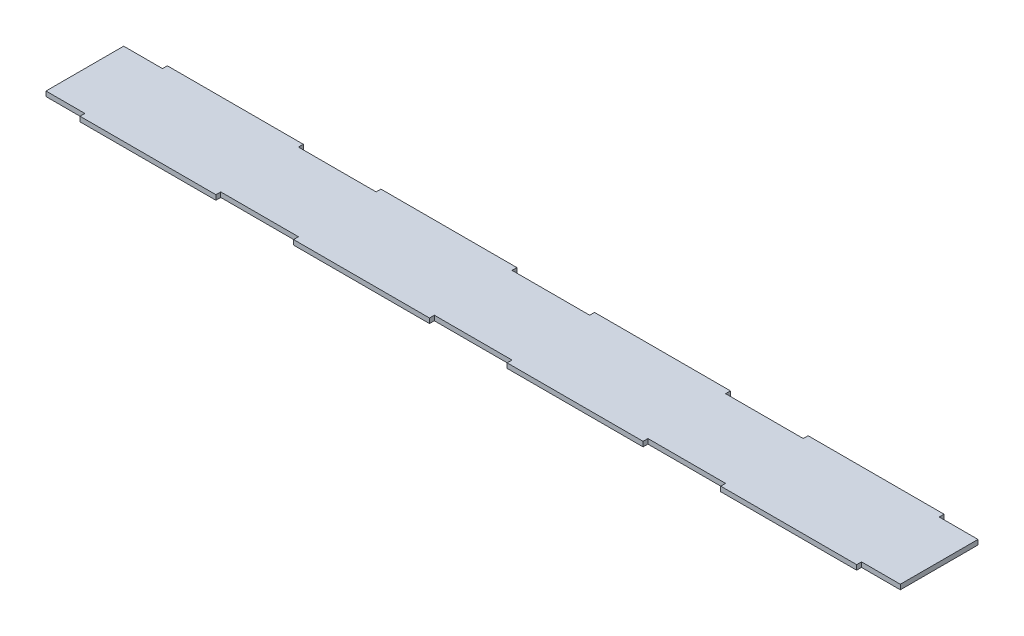
ISO-10303-21;
HEADER;
FILE_DESCRIPTION(('STEP AP214'),'2;1');
FILE_NAME('part.step','',(''),(''),'','','');
FILE_SCHEMA(('AUTOMOTIVE_DESIGN { 1 0 10303 214 1 1 1 1 }'));
ENDSEC;
DATA;
#1=APPLICATION_CONTEXT('core data for automotive mechanical design processes');
#2=APPLICATION_PROTOCOL_DEFINITION('international standard','automotive_design',2000,#1);
#3=PRODUCT_CONTEXT('',#1,'mechanical');
#4=PRODUCT('Part','Part','',(#3));
#5=PRODUCT_RELATED_PRODUCT_CATEGORY('part','',(#4));
#6=PRODUCT_DEFINITION_FORMATION('','',#4);
#7=PRODUCT_DEFINITION_CONTEXT('part definition',#1,'design');
#8=PRODUCT_DEFINITION('design','',#6,#7);
#9=PRODUCT_DEFINITION_SHAPE('','',#8);
#10=(LENGTH_UNIT() NAMED_UNIT(*) SI_UNIT(.MILLI.,.METRE.));
#11=(NAMED_UNIT(*) PLANE_ANGLE_UNIT() SI_UNIT($,.RADIAN.));
#12=(NAMED_UNIT(*) SI_UNIT($,.STERADIAN.) SOLID_ANGLE_UNIT());
#13=UNCERTAINTY_MEASURE_WITH_UNIT(LENGTH_MEASURE(1.E-05),#10,'distance_accuracy_value','');
#14=(GEOMETRIC_REPRESENTATION_CONTEXT(3) GLOBAL_UNCERTAINTY_ASSIGNED_CONTEXT((#13)) GLOBAL_UNIT_ASSIGNED_CONTEXT((#10,
#11,#12)) REPRESENTATION_CONTEXT('',''));
#15=CARTESIAN_POINT('',(0.,0.,0.));
#16=DIRECTION('',(0.,0.,1.));
#17=DIRECTION('',(1.,0.,0.));
#18=AXIS2_PLACEMENT_3D('',#15,#16,#17);
#19=CARTESIAN_POINT('',(0.,3.175,-25.4000000000001));
#20=DIRECTION('',(0.,0.,1.));
#21=DIRECTION('',(1.,0.,0.));
#22=AXIS2_PLACEMENT_3D('',#19,#20,#21);
#23=PLANE('',#22);
#24=DIRECTION('',(-1.,0.,0.));
#25=VECTOR('',#24,1.);
#26=CARTESIAN_POINT('',(0.,0.,-25.4000000000001));
#27=LINE('',#26,#25);
#28=CARTESIAN_POINT('',(25.4,0.,-25.4));
#29=VERTEX_POINT('',#28);
#30=CARTESIAN_POINT('',(0.,0.,-25.4000000000001));
#31=VERTEX_POINT('',#30);
#32=EDGE_CURVE('E308',#29,#31,#27,.T.);
#33=ORIENTED_EDGE('',*,*,#32,.T.);
#34=DIRECTION('',(0.,-1.,0.));
#35=VECTOR('',#34,1.);
#36=CARTESIAN_POINT('',(0.,3.175,-25.4000000000001));
#37=LINE('',#36,#35);
#38=CARTESIAN_POINT('',(0.,3.175,-25.4000000000001));
#39=VERTEX_POINT('',#38);
#40=EDGE_CURVE('E11',#39,#31,#37,.T.);
#41=ORIENTED_EDGE('',*,*,#40,.F.);
#42=DIRECTION('',(-1.,0.,0.));
#43=VECTOR('',#42,1.);
#44=CARTESIAN_POINT('',(0.,3.175,-25.4000000000001));
#45=LINE('',#44,#43);
#46=CARTESIAN_POINT('',(25.4,3.175,-25.4));
#47=VERTEX_POINT('',#46);
#48=EDGE_CURVE('E420',#47,#39,#45,.T.);
#49=ORIENTED_EDGE('',*,*,#48,.F.);
#50=DIRECTION('',(0.,-1.,0.));
#51=VECTOR('',#50,1.);
#52=CARTESIAN_POINT('',(25.4,3.175,-25.4));
#53=LINE('',#52,#51);
#54=EDGE_CURVE('E304',#47,#29,#53,.T.);
#55=ORIENTED_EDGE('',*,*,#54,.T.);
#56=EDGE_LOOP('',(#33,#41,#49,#55));
#57=FACE_BOUND('',#56,.T.);
#58=ADVANCED_FACE('F39',(#57),#23,.F.);
#59=CARTESIAN_POINT('',(0.,3.175,25.4000000000001));
#60=DIRECTION('',(1.,0.,0.));
#61=DIRECTION('',(0.,0.,-1.));
#62=AXIS2_PLACEMENT_3D('',#59,#60,#61);
#63=PLANE('',#62);
#64=DIRECTION('',(0.,0.,1.));
#65=VECTOR('',#64,1.);
#66=CARTESIAN_POINT('',(0.,0.,25.4000000000001));
#67=LINE('',#66,#65);
#68=CARTESIAN_POINT('',(0.,0.,25.4000000000001));
#69=VERTEX_POINT('',#68);
#70=EDGE_CURVE('E312',#31,#69,#67,.T.);
#71=ORIENTED_EDGE('',*,*,#70,.T.);
#72=DIRECTION('',(0.,-1.,0.));
#73=VECTOR('',#72,1.);
#74=CARTESIAN_POINT('',(0.,3.175,25.4000000000001));
#75=LINE('',#74,#73);
#76=CARTESIAN_POINT('',(0.,3.175,25.4000000000001));
#77=VERTEX_POINT('',#76);
#78=EDGE_CURVE('E48',#77,#69,#75,.T.);
#79=ORIENTED_EDGE('',*,*,#78,.F.);
#80=DIRECTION('',(0.,0.,1.));
#81=VECTOR('',#80,1.);
#82=CARTESIAN_POINT('',(0.,3.175,25.4000000000001));
#83=LINE('',#82,#81);
#84=EDGE_CURVE('E183',#39,#77,#83,.T.);
#85=ORIENTED_EDGE('',*,*,#84,.F.);
#86=ORIENTED_EDGE('',*,*,#40,.T.);
#87=EDGE_LOOP('',(#71,#79,#85,#86));
#88=FACE_BOUND('',#87,.T.);
#89=ADVANCED_FACE('F681',(#88),#63,.F.);
#90=CARTESIAN_POINT('',(0.,3.175,25.4000000000001));
#91=DIRECTION('',(0.,0.,-1.));
#92=DIRECTION('',(-1.,0.,0.));
#93=AXIS2_PLACEMENT_3D('',#90,#91,#92);
#94=PLANE('',#93);
#95=DIRECTION('',(1.,0.,0.));
#96=VECTOR('',#95,1.);
#97=CARTESIAN_POINT('',(0.,0.,25.4000000000001));
#98=LINE('',#97,#96);
#99=CARTESIAN_POINT('',(25.4,0.,25.4));
#100=VERTEX_POINT('',#99);
#101=EDGE_CURVE('E315',#69,#100,#98,.T.);
#102=ORIENTED_EDGE('',*,*,#101,.T.);
#103=DIRECTION('',(0.,-1.,0.));
#104=VECTOR('',#103,1.);
#105=CARTESIAN_POINT('',(25.4,3.175,25.4));
#106=LINE('',#105,#104);
#107=CARTESIAN_POINT('',(25.4,3.175,25.4));
#108=VERTEX_POINT('',#107);
#109=EDGE_CURVE('E543',#108,#100,#106,.T.);
#110=ORIENTED_EDGE('',*,*,#109,.F.);
#111=DIRECTION('',(1.,0.,0.));
#112=VECTOR('',#111,1.);
#113=CARTESIAN_POINT('',(0.,3.175,25.4000000000001));
#114=LINE('',#113,#112);
#115=EDGE_CURVE('E553',#77,#108,#114,.T.);
#116=ORIENTED_EDGE('',*,*,#115,.F.);
#117=ORIENTED_EDGE('',*,*,#78,.T.);
#118=EDGE_LOOP('',(#102,#110,#116,#117));
#119=FACE_BOUND('',#118,.T.);
#120=ADVANCED_FACE('F551',(#119),#94,.F.);
#121=CARTESIAN_POINT('',(25.4,3.175,25.4));
#122=DIRECTION('',(1.,0.,0.));
#123=DIRECTION('',(0.,0.,-1.));
#124=AXIS2_PLACEMENT_3D('',#121,#122,#123);
#125=PLANE('',#124);
#126=DIRECTION('',(0.,0.,1.));
#127=VECTOR('',#126,1.);
#128=CARTESIAN_POINT('',(25.4,0.,25.4));
#129=LINE('',#128,#127);
#130=CARTESIAN_POINT('',(25.4,0.,28.575));
#131=VERTEX_POINT('',#130);
#132=EDGE_CURVE('E318',#100,#131,#129,.T.);
#133=ORIENTED_EDGE('',*,*,#132,.T.);
#134=DIRECTION('',(0.,-1.,0.));
#135=VECTOR('',#134,1.);
#136=CARTESIAN_POINT('',(25.4,3.175,28.575));
#137=LINE('',#136,#135);
#138=CARTESIAN_POINT('',(25.4,3.175,28.575));
#139=VERTEX_POINT('',#138);
#140=EDGE_CURVE('E539',#139,#131,#137,.T.);
#141=ORIENTED_EDGE('',*,*,#140,.F.);
#142=DIRECTION('',(0.,0.,1.));
#143=VECTOR('',#142,1.);
#144=CARTESIAN_POINT('',(25.4,3.175,25.4));
#145=LINE('',#144,#143);
#146=EDGE_CURVE('E572',#108,#139,#145,.T.);
#147=ORIENTED_EDGE('',*,*,#146,.F.);
#148=ORIENTED_EDGE('',*,*,#109,.T.);
#149=EDGE_LOOP('',(#133,#141,#147,#148));
#150=FACE_BOUND('',#149,.T.);
#151=ADVANCED_FACE('F562',(#150),#125,.F.);
#152=CARTESIAN_POINT('',(25.4,3.175,28.575));
#153=DIRECTION('',(0.,0.,-1.));
#154=DIRECTION('',(-1.,0.,0.));
#155=AXIS2_PLACEMENT_3D('',#152,#153,#154);
#156=PLANE('',#155);
#157=DIRECTION('',(1.,0.,0.));
#158=VECTOR('',#157,1.);
#159=CARTESIAN_POINT('',(25.4,0.,28.575));
#160=LINE('',#159,#158);
#161=CARTESIAN_POINT('',(114.3,0.,28.575));
#162=VERTEX_POINT('',#161);
#163=EDGE_CURVE('E321',#131,#162,#160,.T.);
#164=ORIENTED_EDGE('',*,*,#163,.T.);
#165=DIRECTION('',(0.,-1.,0.));
#166=VECTOR('',#165,1.);
#167=CARTESIAN_POINT('',(114.3,3.175,28.575));
#168=LINE('',#167,#166);
#169=CARTESIAN_POINT('',(114.3,3.175,28.575));
#170=VERTEX_POINT('',#169);
#171=EDGE_CURVE('E535',#170,#162,#168,.T.);
#172=ORIENTED_EDGE('',*,*,#171,.F.);
#173=DIRECTION('',(1.,0.,0.));
#174=VECTOR('',#173,1.);
#175=CARTESIAN_POINT('',(25.4,3.175,28.575));
#176=LINE('',#175,#174);
#177=EDGE_CURVE('E568',#139,#170,#176,.T.);
#178=ORIENTED_EDGE('',*,*,#177,.F.);
#179=ORIENTED_EDGE('',*,*,#140,.T.);
#180=EDGE_LOOP('',(#164,#172,#178,#179));
#181=FACE_BOUND('',#180,.T.);
#182=ADVANCED_FACE('F566',(#181),#156,.F.);
#183=CARTESIAN_POINT('',(114.3,3.175,28.575));
#184=DIRECTION('',(-1.,0.,0.));
#185=DIRECTION('',(0.,0.,1.));
#186=AXIS2_PLACEMENT_3D('',#183,#184,#185);
#187=PLANE('',#186);
#188=DIRECTION('',(0.,0.,-1.));
#189=VECTOR('',#188,1.);
#190=CARTESIAN_POINT('',(114.3,0.,28.575));
#191=LINE('',#190,#189);
#192=CARTESIAN_POINT('',(114.3,0.,25.4000000000001));
#193=VERTEX_POINT('',#192);
#194=EDGE_CURVE('E324',#162,#193,#191,.T.);
#195=ORIENTED_EDGE('',*,*,#194,.T.);
#196=DIRECTION('',(0.,-1.,0.));
#197=VECTOR('',#196,1.);
#198=CARTESIAN_POINT('',(114.3,3.175,25.4000000000001));
#199=LINE('',#198,#197);
#200=CARTESIAN_POINT('',(114.3,3.175,25.4000000000001));
#201=VERTEX_POINT('',#200);
#202=EDGE_CURVE('E531',#201,#193,#199,.T.);
#203=ORIENTED_EDGE('',*,*,#202,.F.);
#204=DIRECTION('',(0.,0.,-1.));
#205=VECTOR('',#204,1.);
#206=CARTESIAN_POINT('',(114.3,3.175,28.575));
#207=LINE('',#206,#205);
#208=EDGE_CURVE('E571',#170,#201,#207,.T.);
#209=ORIENTED_EDGE('',*,*,#208,.F.);
#210=ORIENTED_EDGE('',*,*,#171,.T.);
#211=EDGE_LOOP('',(#195,#203,#209,#210));
#212=FACE_BOUND('',#211,.T.);
#213=ADVANCED_FACE('F694',(#212),#187,.F.);
#214=CARTESIAN_POINT('',(139.7,3.175,25.4000000000001));
#215=DIRECTION('',(0.,0.,-1.));
#216=DIRECTION('',(-1.,0.,0.));
#217=AXIS2_PLACEMENT_3D('',#214,#215,#216);
#218=PLANE('',#217);
#219=DIRECTION('',(1.,0.,0.));
#220=VECTOR('',#219,1.);
#221=CARTESIAN_POINT('',(139.7,0.,25.4000000000001));
#222=LINE('',#221,#220);
#223=CARTESIAN_POINT('',(165.1,0.,25.4));
#224=VERTEX_POINT('',#223);
#225=EDGE_CURVE('E328',#193,#224,#222,.T.);
#226=ORIENTED_EDGE('',*,*,#225,.T.);
#227=DIRECTION('',(0.,-1.,0.));
#228=VECTOR('',#227,1.);
#229=CARTESIAN_POINT('',(165.1,3.175,25.4));
#230=LINE('',#229,#228);
#231=CARTESIAN_POINT('',(165.1,3.175,25.4));
#232=VERTEX_POINT('',#231);
#233=EDGE_CURVE('E527',#232,#224,#230,.T.);
#234=ORIENTED_EDGE('',*,*,#233,.F.);
#235=DIRECTION('',(1.,0.,0.));
#236=VECTOR('',#235,1.);
#237=CARTESIAN_POINT('',(114.3,3.175,25.4000000000001));
#238=LINE('',#237,#236);
#239=EDGE_CURVE('E576',#201,#232,#238,.T.);
#240=ORIENTED_EDGE('',*,*,#239,.F.);
#241=ORIENTED_EDGE('',*,*,#202,.T.);
#242=EDGE_LOOP('',(#226,#234,#240,#241));
#243=FACE_BOUND('',#242,.T.);
#244=ADVANCED_FACE('F697',(#243),#218,.F.);
#245=CARTESIAN_POINT('',(165.1,3.175,25.4));
#246=DIRECTION('',(1.,0.,0.));
#247=DIRECTION('',(0.,0.,-1.));
#248=AXIS2_PLACEMENT_3D('',#245,#246,#247);
#249=PLANE('',#248);
#250=DIRECTION('',(0.,0.,1.));
#251=VECTOR('',#250,1.);
#252=CARTESIAN_POINT('',(165.1,0.,25.4));
#253=LINE('',#252,#251);
#254=CARTESIAN_POINT('',(165.1,0.,28.575));
#255=VERTEX_POINT('',#254);
#256=EDGE_CURVE('E331',#224,#255,#253,.T.);
#257=ORIENTED_EDGE('',*,*,#256,.T.);
#258=DIRECTION('',(0.,-1.,0.));
#259=VECTOR('',#258,1.);
#260=CARTESIAN_POINT('',(165.1,3.175,28.575));
#261=LINE('',#260,#259);
#262=CARTESIAN_POINT('',(165.1,3.175,28.575));
#263=VERTEX_POINT('',#262);
#264=EDGE_CURVE('E523',#263,#255,#261,.T.);
#265=ORIENTED_EDGE('',*,*,#264,.F.);
#266=DIRECTION('',(0.,0.,1.));
#267=VECTOR('',#266,1.);
#268=CARTESIAN_POINT('',(165.1,3.175,25.4));
#269=LINE('',#268,#267);
#270=EDGE_CURVE('E583',#232,#263,#269,.T.);
#271=ORIENTED_EDGE('',*,*,#270,.F.);
#272=ORIENTED_EDGE('',*,*,#233,.T.);
#273=EDGE_LOOP('',(#257,#265,#271,#272));
#274=FACE_BOUND('',#273,.T.);
#275=ADVANCED_FACE('F701',(#274),#249,.F.);
#276=CARTESIAN_POINT('',(165.1,3.175,28.575));
#277=DIRECTION('',(0.,0.,-1.));
#278=DIRECTION('',(-1.,0.,0.));
#279=AXIS2_PLACEMENT_3D('',#276,#277,#278);
#280=PLANE('',#279);
#281=DIRECTION('',(1.,0.,0.));
#282=VECTOR('',#281,1.);
#283=CARTESIAN_POINT('',(165.1,0.,28.575));
#284=LINE('',#283,#282);
#285=CARTESIAN_POINT('',(254.,0.,28.575));
#286=VERTEX_POINT('',#285);
#287=EDGE_CURVE('E334',#255,#286,#284,.T.);
#288=ORIENTED_EDGE('',*,*,#287,.T.);
#289=DIRECTION('',(0.,-1.,0.));
#290=VECTOR('',#289,1.);
#291=CARTESIAN_POINT('',(254.,3.175,28.575));
#292=LINE('',#291,#290);
#293=CARTESIAN_POINT('',(254.,3.175,28.575));
#294=VERTEX_POINT('',#293);
#295=EDGE_CURVE('E519',#294,#286,#292,.T.);
#296=ORIENTED_EDGE('',*,*,#295,.F.);
#297=DIRECTION('',(1.,0.,0.));
#298=VECTOR('',#297,1.);
#299=CARTESIAN_POINT('',(165.1,3.175,28.575));
#300=LINE('',#299,#298);
#301=EDGE_CURVE('E586',#263,#294,#300,.T.);
#302=ORIENTED_EDGE('',*,*,#301,.F.);
#303=ORIENTED_EDGE('',*,*,#264,.T.);
#304=EDGE_LOOP('',(#288,#296,#302,#303));
#305=FACE_BOUND('',#304,.T.);
#306=ADVANCED_FACE('F705',(#305),#280,.F.);
#307=CARTESIAN_POINT('',(254.,3.175,28.575));
#308=DIRECTION('',(-1.,0.,0.));
#309=DIRECTION('',(0.,0.,1.));
#310=AXIS2_PLACEMENT_3D('',#307,#308,#309);
#311=PLANE('',#310);
#312=DIRECTION('',(0.,0.,-1.));
#313=VECTOR('',#312,1.);
#314=CARTESIAN_POINT('',(254.,0.,28.575));
#315=LINE('',#314,#313);
#316=CARTESIAN_POINT('',(254.,0.,25.4000000000001));
#317=VERTEX_POINT('',#316);
#318=EDGE_CURVE('E337',#286,#317,#315,.T.);
#319=ORIENTED_EDGE('',*,*,#318,.T.);
#320=DIRECTION('',(0.,-1.,0.));
#321=VECTOR('',#320,1.);
#322=CARTESIAN_POINT('',(254.,3.175,25.4000000000001));
#323=LINE('',#322,#321);
#324=CARTESIAN_POINT('',(254.,3.175,25.4000000000001));
#325=VERTEX_POINT('',#324);
#326=EDGE_CURVE('E515',#325,#317,#323,.T.);
#327=ORIENTED_EDGE('',*,*,#326,.F.);
#328=DIRECTION('',(0.,0.,-1.));
#329=VECTOR('',#328,1.);
#330=CARTESIAN_POINT('',(254.,3.175,28.575));
#331=LINE('',#330,#329);
#332=EDGE_CURVE('E589',#294,#325,#331,.T.);
#333=ORIENTED_EDGE('',*,*,#332,.F.);
#334=ORIENTED_EDGE('',*,*,#295,.T.);
#335=EDGE_LOOP('',(#319,#327,#333,#334));
#336=FACE_BOUND('',#335,.T.);
#337=ADVANCED_FACE('F709',(#336),#311,.F.);
#338=CARTESIAN_POINT('',(279.4,3.175,25.4000000000001));
#339=DIRECTION('',(0.,0.,-1.));
#340=DIRECTION('',(-1.,0.,0.));
#341=AXIS2_PLACEMENT_3D('',#338,#339,#340);
#342=PLANE('',#341);
#343=DIRECTION('',(1.,0.,0.));
#344=VECTOR('',#343,1.);
#345=CARTESIAN_POINT('',(279.4,0.,25.4000000000001));
#346=LINE('',#345,#344);
#347=CARTESIAN_POINT('',(304.8,0.,25.4));
#348=VERTEX_POINT('',#347);
#349=EDGE_CURVE('E341',#317,#348,#346,.T.);
#350=ORIENTED_EDGE('',*,*,#349,.T.);
#351=DIRECTION('',(0.,-1.,0.));
#352=VECTOR('',#351,1.);
#353=CARTESIAN_POINT('',(304.8,3.175,25.4));
#354=LINE('',#353,#352);
#355=CARTESIAN_POINT('',(304.8,3.175,25.4));
#356=VERTEX_POINT('',#355);
#357=EDGE_CURVE('E511',#356,#348,#354,.T.);
#358=ORIENTED_EDGE('',*,*,#357,.F.);
#359=DIRECTION('',(1.,0.,0.));
#360=VECTOR('',#359,1.);
#361=CARTESIAN_POINT('',(254.,3.175,25.4000000000001));
#362=LINE('',#361,#360);
#363=EDGE_CURVE('E592',#325,#356,#362,.T.);
#364=ORIENTED_EDGE('',*,*,#363,.F.);
#365=ORIENTED_EDGE('',*,*,#326,.T.);
#366=EDGE_LOOP('',(#350,#358,#364,#365));
#367=FACE_BOUND('',#366,.T.);
#368=ADVANCED_FACE('F713',(#367),#342,.F.);
#369=CARTESIAN_POINT('',(304.8,3.175,25.4));
#370=DIRECTION('',(1.,0.,0.));
#371=DIRECTION('',(0.,0.,-1.));
#372=AXIS2_PLACEMENT_3D('',#369,#370,#371);
#373=PLANE('',#372);
#374=DIRECTION('',(0.,0.,1.));
#375=VECTOR('',#374,1.);
#376=CARTESIAN_POINT('',(304.8,0.,25.4));
#377=LINE('',#376,#375);
#378=CARTESIAN_POINT('',(304.8,0.,28.575));
#379=VERTEX_POINT('',#378);
#380=EDGE_CURVE('E344',#348,#379,#377,.T.);
#381=ORIENTED_EDGE('',*,*,#380,.T.);
#382=DIRECTION('',(0.,-1.,0.));
#383=VECTOR('',#382,1.);
#384=CARTESIAN_POINT('',(304.8,3.175,28.575));
#385=LINE('',#384,#383);
#386=CARTESIAN_POINT('',(304.8,3.175,28.575));
#387=VERTEX_POINT('',#386);
#388=EDGE_CURVE('E507',#387,#379,#385,.T.);
#389=ORIENTED_EDGE('',*,*,#388,.F.);
#390=DIRECTION('',(0.,0.,1.));
#391=VECTOR('',#390,1.);
#392=CARTESIAN_POINT('',(304.8,3.175,25.4));
#393=LINE('',#392,#391);
#394=EDGE_CURVE('E595',#356,#387,#393,.T.);
#395=ORIENTED_EDGE('',*,*,#394,.F.);
#396=ORIENTED_EDGE('',*,*,#357,.T.);
#397=EDGE_LOOP('',(#381,#389,#395,#396));
#398=FACE_BOUND('',#397,.T.);
#399=ADVANCED_FACE('F717',(#398),#373,.F.);
#400=CARTESIAN_POINT('',(304.8,3.175,28.575));
#401=DIRECTION('',(0.,0.,-1.));
#402=DIRECTION('',(-1.,0.,0.));
#403=AXIS2_PLACEMENT_3D('',#400,#401,#402);
#404=PLANE('',#403);
#405=DIRECTION('',(1.,0.,0.));
#406=VECTOR('',#405,1.);
#407=CARTESIAN_POINT('',(304.8,0.,28.575));
#408=LINE('',#407,#406);
#409=CARTESIAN_POINT('',(393.7,0.,28.575));
#410=VERTEX_POINT('',#409);
#411=EDGE_CURVE('E347',#379,#410,#408,.T.);
#412=ORIENTED_EDGE('',*,*,#411,.T.);
#413=DIRECTION('',(0.,-1.,0.));
#414=VECTOR('',#413,1.);
#415=CARTESIAN_POINT('',(393.7,3.175,28.575));
#416=LINE('',#415,#414);
#417=CARTESIAN_POINT('',(393.7,3.175,28.575));
#418=VERTEX_POINT('',#417);
#419=EDGE_CURVE('E503',#418,#410,#416,.T.);
#420=ORIENTED_EDGE('',*,*,#419,.F.);
#421=DIRECTION('',(1.,0.,0.));
#422=VECTOR('',#421,1.);
#423=CARTESIAN_POINT('',(304.8,3.175,28.575));
#424=LINE('',#423,#422);
#425=EDGE_CURVE('E598',#387,#418,#424,.T.);
#426=ORIENTED_EDGE('',*,*,#425,.F.);
#427=ORIENTED_EDGE('',*,*,#388,.T.);
#428=EDGE_LOOP('',(#412,#420,#426,#427));
#429=FACE_BOUND('',#428,.T.);
#430=ADVANCED_FACE('F721',(#429),#404,.F.);
#431=CARTESIAN_POINT('',(393.7,3.175,28.575));
#432=DIRECTION('',(-1.,0.,0.));
#433=DIRECTION('',(0.,0.,1.));
#434=AXIS2_PLACEMENT_3D('',#431,#432,#433);
#435=PLANE('',#434);
#436=DIRECTION('',(0.,0.,-1.));
#437=VECTOR('',#436,1.);
#438=CARTESIAN_POINT('',(393.7,0.,28.575));
#439=LINE('',#438,#437);
#440=CARTESIAN_POINT('',(393.7,0.,25.4000000000001));
#441=VERTEX_POINT('',#440);
#442=EDGE_CURVE('E350',#410,#441,#439,.T.);
#443=ORIENTED_EDGE('',*,*,#442,.T.);
#444=DIRECTION('',(0.,-1.,0.));
#445=VECTOR('',#444,1.);
#446=CARTESIAN_POINT('',(393.7,3.175,25.4000000000001));
#447=LINE('',#446,#445);
#448=CARTESIAN_POINT('',(393.7,3.175,25.4000000000001));
#449=VERTEX_POINT('',#448);
#450=EDGE_CURVE('E499',#449,#441,#447,.T.);
#451=ORIENTED_EDGE('',*,*,#450,.F.);
#452=DIRECTION('',(0.,0.,-1.));
#453=VECTOR('',#452,1.);
#454=CARTESIAN_POINT('',(393.7,3.175,28.575));
#455=LINE('',#454,#453);
#456=EDGE_CURVE('E601',#418,#449,#455,.T.);
#457=ORIENTED_EDGE('',*,*,#456,.F.);
#458=ORIENTED_EDGE('',*,*,#419,.T.);
#459=EDGE_LOOP('',(#443,#451,#457,#458));
#460=FACE_BOUND('',#459,.T.);
#461=ADVANCED_FACE('F725',(#460),#435,.F.);
#462=CARTESIAN_POINT('',(419.1,3.175,25.4000000000001));
#463=DIRECTION('',(0.,0.,-1.));
#464=DIRECTION('',(-1.,0.,0.));
#465=AXIS2_PLACEMENT_3D('',#462,#463,#464);
#466=PLANE('',#465);
#467=DIRECTION('',(1.,0.,0.));
#468=VECTOR('',#467,1.);
#469=CARTESIAN_POINT('',(419.1,0.,25.4000000000001));
#470=LINE('',#469,#468);
#471=CARTESIAN_POINT('',(444.5,0.,25.4));
#472=VERTEX_POINT('',#471);
#473=EDGE_CURVE('E354',#441,#472,#470,.T.);
#474=ORIENTED_EDGE('',*,*,#473,.T.);
#475=DIRECTION('',(0.,-1.,0.));
#476=VECTOR('',#475,1.);
#477=CARTESIAN_POINT('',(444.5,3.175,25.4));
#478=LINE('',#477,#476);
#479=CARTESIAN_POINT('',(444.5,3.175,25.4));
#480=VERTEX_POINT('',#479);
#481=EDGE_CURVE('E495',#480,#472,#478,.T.);
#482=ORIENTED_EDGE('',*,*,#481,.F.);
#483=DIRECTION('',(1.,0.,0.));
#484=VECTOR('',#483,1.);
#485=CARTESIAN_POINT('',(393.7,3.175,25.4000000000001));
#486=LINE('',#485,#484);
#487=EDGE_CURVE('E604',#449,#480,#486,.T.);
#488=ORIENTED_EDGE('',*,*,#487,.F.);
#489=ORIENTED_EDGE('',*,*,#450,.T.);
#490=EDGE_LOOP('',(#474,#482,#488,#489));
#491=FACE_BOUND('',#490,.T.);
#492=ADVANCED_FACE('F729',(#491),#466,.F.);
#493=CARTESIAN_POINT('',(444.5,3.175,25.4));
#494=DIRECTION('',(1.,0.,0.));
#495=DIRECTION('',(0.,0.,-1.));
#496=AXIS2_PLACEMENT_3D('',#493,#494,#495);
#497=PLANE('',#496);
#498=DIRECTION('',(0.,0.,1.));
#499=VECTOR('',#498,1.);
#500=CARTESIAN_POINT('',(444.5,0.,25.4));
#501=LINE('',#500,#499);
#502=CARTESIAN_POINT('',(444.5,0.,28.575));
#503=VERTEX_POINT('',#502);
#504=EDGE_CURVE('E357',#472,#503,#501,.T.);
#505=ORIENTED_EDGE('',*,*,#504,.T.);
#506=DIRECTION('',(0.,-1.,0.));
#507=VECTOR('',#506,1.);
#508=CARTESIAN_POINT('',(444.5,3.175,28.575));
#509=LINE('',#508,#507);
#510=CARTESIAN_POINT('',(444.5,3.175,28.575));
#511=VERTEX_POINT('',#510);
#512=EDGE_CURVE('E491',#511,#503,#509,.T.);
#513=ORIENTED_EDGE('',*,*,#512,.F.);
#514=DIRECTION('',(0.,0.,1.));
#515=VECTOR('',#514,1.);
#516=CARTESIAN_POINT('',(444.5,3.175,25.4));
#517=LINE('',#516,#515);
#518=EDGE_CURVE('E607',#480,#511,#517,.T.);
#519=ORIENTED_EDGE('',*,*,#518,.F.);
#520=ORIENTED_EDGE('',*,*,#481,.T.);
#521=EDGE_LOOP('',(#505,#513,#519,#520));
#522=FACE_BOUND('',#521,.T.);
#523=ADVANCED_FACE('F733',(#522),#497,.F.);
#524=CARTESIAN_POINT('',(444.5,3.175,28.575));
#525=DIRECTION('',(0.,0.,-1.));
#526=DIRECTION('',(-1.,0.,0.));
#527=AXIS2_PLACEMENT_3D('',#524,#525,#526);
#528=PLANE('',#527);
#529=DIRECTION('',(1.,0.,0.));
#530=VECTOR('',#529,1.);
#531=CARTESIAN_POINT('',(444.5,0.,28.575));
#532=LINE('',#531,#530);
#533=CARTESIAN_POINT('',(533.4,0.,28.575));
#534=VERTEX_POINT('',#533);
#535=EDGE_CURVE('E360',#503,#534,#532,.T.);
#536=ORIENTED_EDGE('',*,*,#535,.T.);
#537=DIRECTION('',(0.,-1.,0.));
#538=VECTOR('',#537,1.);
#539=CARTESIAN_POINT('',(533.4,3.175,28.575));
#540=LINE('',#539,#538);
#541=CARTESIAN_POINT('',(533.4,3.175,28.575));
#542=VERTEX_POINT('',#541);
#543=EDGE_CURVE('E487',#542,#534,#540,.T.);
#544=ORIENTED_EDGE('',*,*,#543,.F.);
#545=DIRECTION('',(1.,0.,0.));
#546=VECTOR('',#545,1.);
#547=CARTESIAN_POINT('',(444.5,3.175,28.575));
#548=LINE('',#547,#546);
#549=EDGE_CURVE('E610',#511,#542,#548,.T.);
#550=ORIENTED_EDGE('',*,*,#549,.F.);
#551=ORIENTED_EDGE('',*,*,#512,.T.);
#552=EDGE_LOOP('',(#536,#544,#550,#551));
#553=FACE_BOUND('',#552,.T.);
#554=ADVANCED_FACE('F737',(#553),#528,.F.);
#555=CARTESIAN_POINT('',(533.4,3.175,28.575));
#556=DIRECTION('',(-1.,0.,0.));
#557=DIRECTION('',(0.,0.,1.));
#558=AXIS2_PLACEMENT_3D('',#555,#556,#557);
#559=PLANE('',#558);
#560=DIRECTION('',(0.,0.,-1.));
#561=VECTOR('',#560,1.);
#562=CARTESIAN_POINT('',(533.4,0.,28.575));
#563=LINE('',#562,#561);
#564=CARTESIAN_POINT('',(533.4,0.,25.4000000000001));
#565=VERTEX_POINT('',#564);
#566=EDGE_CURVE('E363',#534,#565,#563,.T.);
#567=ORIENTED_EDGE('',*,*,#566,.T.);
#568=DIRECTION('',(0.,-1.,0.));
#569=VECTOR('',#568,1.);
#570=CARTESIAN_POINT('',(533.4,3.175,25.4000000000001));
#571=LINE('',#570,#569);
#572=CARTESIAN_POINT('',(533.4,3.175,25.4000000000001));
#573=VERTEX_POINT('',#572);
#574=EDGE_CURVE('E483',#573,#565,#571,.T.);
#575=ORIENTED_EDGE('',*,*,#574,.F.);
#576=DIRECTION('',(0.,0.,-1.));
#577=VECTOR('',#576,1.);
#578=CARTESIAN_POINT('',(533.4,3.175,28.575));
#579=LINE('',#578,#577);
#580=EDGE_CURVE('E613',#542,#573,#579,.T.);
#581=ORIENTED_EDGE('',*,*,#580,.F.);
#582=ORIENTED_EDGE('',*,*,#543,.T.);
#583=EDGE_LOOP('',(#567,#575,#581,#582));
#584=FACE_BOUND('',#583,.T.);
#585=ADVANCED_FACE('F741',(#584),#559,.F.);
#586=CARTESIAN_POINT('',(533.4,3.175,25.4000000000001));
#587=DIRECTION('',(0.,0.,-1.));
#588=DIRECTION('',(-1.,0.,0.));
#589=AXIS2_PLACEMENT_3D('',#586,#587,#588);
#590=PLANE('',#589);
#591=DIRECTION('',(1.,0.,0.));
#592=VECTOR('',#591,1.);
#593=CARTESIAN_POINT('',(533.4,0.,25.4000000000001));
#594=LINE('',#593,#592);
#595=CARTESIAN_POINT('',(558.8,0.,25.4000000000001));
#596=VERTEX_POINT('',#595);
#597=EDGE_CURVE('E366',#565,#596,#594,.T.);
#598=ORIENTED_EDGE('',*,*,#597,.T.);
#599=DIRECTION('',(0.,-1.,0.));
#600=VECTOR('',#599,1.);
#601=CARTESIAN_POINT('',(558.8,3.175,25.4000000000001));
#602=LINE('',#601,#600);
#603=CARTESIAN_POINT('',(558.8,3.175,25.4000000000001));
#604=VERTEX_POINT('',#603);
#605=EDGE_CURVE('E479',#604,#596,#602,.T.);
#606=ORIENTED_EDGE('',*,*,#605,.F.);
#607=DIRECTION('',(1.,0.,0.));
#608=VECTOR('',#607,1.);
#609=CARTESIAN_POINT('',(533.4,3.175,25.4000000000001));
#610=LINE('',#609,#608);
#611=EDGE_CURVE('E616',#573,#604,#610,.T.);
#612=ORIENTED_EDGE('',*,*,#611,.F.);
#613=ORIENTED_EDGE('',*,*,#574,.T.);
#614=EDGE_LOOP('',(#598,#606,#612,#613));
#615=FACE_BOUND('',#614,.T.);
#616=ADVANCED_FACE('F745',(#615),#590,.F.);
#617=CARTESIAN_POINT('',(558.8,3.175,25.4000000000001));
#618=DIRECTION('',(-1.,0.,0.));
#619=DIRECTION('',(0.,0.,1.));
#620=AXIS2_PLACEMENT_3D('',#617,#618,#619);
#621=PLANE('',#620);
#622=DIRECTION('',(0.,0.,-1.));
#623=VECTOR('',#622,1.);
#624=CARTESIAN_POINT('',(558.8,0.,25.4000000000001));
#625=LINE('',#624,#623);
#626=CARTESIAN_POINT('',(558.8,0.,-25.4000000000001));
#627=VERTEX_POINT('',#626);
#628=EDGE_CURVE('E369',#596,#627,#625,.T.);
#629=ORIENTED_EDGE('',*,*,#628,.T.);
#630=DIRECTION('',(0.,-1.,0.));
#631=VECTOR('',#630,1.);
#632=CARTESIAN_POINT('',(558.8,3.175,-25.4000000000001));
#633=LINE('',#632,#631);
#634=CARTESIAN_POINT('',(558.8,3.175,-25.4000000000001));
#635=VERTEX_POINT('',#634);
#636=EDGE_CURVE('E475',#635,#627,#633,.T.);
#637=ORIENTED_EDGE('',*,*,#636,.F.);
#638=DIRECTION('',(0.,0.,-1.));
#639=VECTOR('',#638,1.);
#640=CARTESIAN_POINT('',(558.8,3.175,25.4000000000001));
#641=LINE('',#640,#639);
#642=EDGE_CURVE('E619',#604,#635,#641,.T.);
#643=ORIENTED_EDGE('',*,*,#642,.F.);
#644=ORIENTED_EDGE('',*,*,#605,.T.);
#645=EDGE_LOOP('',(#629,#637,#643,#644));
#646=FACE_BOUND('',#645,.T.);
#647=ADVANCED_FACE('F749',(#646),#621,.F.);
#648=CARTESIAN_POINT('',(533.4,3.175,-25.4000000000001));
#649=DIRECTION('',(0.,0.,1.));
#650=DIRECTION('',(1.,0.,0.));
#651=AXIS2_PLACEMENT_3D('',#648,#649,#650);
#652=PLANE('',#651);
#653=DIRECTION('',(-1.,0.,0.));
#654=VECTOR('',#653,1.);
#655=CARTESIAN_POINT('',(533.4,0.,-25.4000000000001));
#656=LINE('',#655,#654);
#657=CARTESIAN_POINT('',(533.4,0.,-25.4000000000001));
#658=VERTEX_POINT('',#657);
#659=EDGE_CURVE('E372',#627,#658,#656,.T.);
#660=ORIENTED_EDGE('',*,*,#659,.T.);
#661=DIRECTION('',(0.,-1.,0.));
#662=VECTOR('',#661,1.);
#663=CARTESIAN_POINT('',(533.4,3.175,-25.4000000000001));
#664=LINE('',#663,#662);
#665=CARTESIAN_POINT('',(533.4,3.175,-25.4000000000001));
#666=VERTEX_POINT('',#665);
#667=EDGE_CURVE('E471',#666,#658,#664,.T.);
#668=ORIENTED_EDGE('',*,*,#667,.F.);
#669=DIRECTION('',(-1.,0.,0.));
#670=VECTOR('',#669,1.);
#671=CARTESIAN_POINT('',(533.4,3.175,-25.4000000000001));
#672=LINE('',#671,#670);
#673=EDGE_CURVE('E622',#635,#666,#672,.T.);
#674=ORIENTED_EDGE('',*,*,#673,.F.);
#675=ORIENTED_EDGE('',*,*,#636,.T.);
#676=EDGE_LOOP('',(#660,#668,#674,#675));
#677=FACE_BOUND('',#676,.T.);
#678=ADVANCED_FACE('F753',(#677),#652,.F.);
#679=CARTESIAN_POINT('',(533.4,3.175,-28.575));
#680=DIRECTION('',(-1.,0.,0.));
#681=DIRECTION('',(0.,0.,1.));
#682=AXIS2_PLACEMENT_3D('',#679,#680,#681);
#683=PLANE('',#682);
#684=DIRECTION('',(0.,0.,-1.));
#685=VECTOR('',#684,1.);
#686=CARTESIAN_POINT('',(533.4,0.,-28.575));
#687=LINE('',#686,#685);
#688=CARTESIAN_POINT('',(533.4,0.,-28.575));
#689=VERTEX_POINT('',#688);
#690=EDGE_CURVE('E375',#658,#689,#687,.T.);
#691=ORIENTED_EDGE('',*,*,#690,.T.);
#692=DIRECTION('',(0.,-1.,0.));
#693=VECTOR('',#692,1.);
#694=CARTESIAN_POINT('',(533.4,3.175,-28.575));
#695=LINE('',#694,#693);
#696=CARTESIAN_POINT('',(533.4,3.175,-28.575));
#697=VERTEX_POINT('',#696);
#698=EDGE_CURVE('E467',#697,#689,#695,.T.);
#699=ORIENTED_EDGE('',*,*,#698,.F.);
#700=DIRECTION('',(0.,0.,-1.));
#701=VECTOR('',#700,1.);
#702=CARTESIAN_POINT('',(533.4,3.175,-28.575));
#703=LINE('',#702,#701);
#704=EDGE_CURVE('E625',#666,#697,#703,.T.);
#705=ORIENTED_EDGE('',*,*,#704,.F.);
#706=ORIENTED_EDGE('',*,*,#667,.T.);
#707=EDGE_LOOP('',(#691,#699,#705,#706));
#708=FACE_BOUND('',#707,.T.);
#709=ADVANCED_FACE('F757',(#708),#683,.F.);
#710=CARTESIAN_POINT('',(444.5,3.175,-28.575));
#711=DIRECTION('',(0.,0.,1.));
#712=DIRECTION('',(1.,0.,0.));
#713=AXIS2_PLACEMENT_3D('',#710,#711,#712);
#714=PLANE('',#713);
#715=DIRECTION('',(-1.,0.,0.));
#716=VECTOR('',#715,1.);
#717=CARTESIAN_POINT('',(444.5,0.,-28.575));
#718=LINE('',#717,#716);
#719=CARTESIAN_POINT('',(444.5,0.,-28.575));
#720=VERTEX_POINT('',#719);
#721=EDGE_CURVE('E378',#689,#720,#718,.T.);
#722=ORIENTED_EDGE('',*,*,#721,.T.);
#723=DIRECTION('',(0.,-1.,0.));
#724=VECTOR('',#723,1.);
#725=CARTESIAN_POINT('',(444.5,3.175,-28.575));
#726=LINE('',#725,#724);
#727=CARTESIAN_POINT('',(444.5,3.175,-28.575));
#728=VERTEX_POINT('',#727);
#729=EDGE_CURVE('E463',#728,#720,#726,.T.);
#730=ORIENTED_EDGE('',*,*,#729,.F.);
#731=DIRECTION('',(-1.,0.,0.));
#732=VECTOR('',#731,1.);
#733=CARTESIAN_POINT('',(444.5,3.175,-28.575));
#734=LINE('',#733,#732);
#735=EDGE_CURVE('E628',#697,#728,#734,.T.);
#736=ORIENTED_EDGE('',*,*,#735,.F.);
#737=ORIENTED_EDGE('',*,*,#698,.T.);
#738=EDGE_LOOP('',(#722,#730,#736,#737));
#739=FACE_BOUND('',#738,.T.);
#740=ADVANCED_FACE('F761',(#739),#714,.F.);
#741=CARTESIAN_POINT('',(444.5,3.175,-25.4));
#742=DIRECTION('',(1.,0.,0.));
#743=DIRECTION('',(0.,0.,-1.));
#744=AXIS2_PLACEMENT_3D('',#741,#742,#743);
#745=PLANE('',#744);
#746=DIRECTION('',(0.,0.,1.));
#747=VECTOR('',#746,1.);
#748=CARTESIAN_POINT('',(444.5,0.,-25.4));
#749=LINE('',#748,#747);
#750=CARTESIAN_POINT('',(444.5,0.,-25.4));
#751=VERTEX_POINT('',#750);
#752=EDGE_CURVE('E381',#720,#751,#749,.T.);
#753=ORIENTED_EDGE('',*,*,#752,.T.);
#754=DIRECTION('',(0.,-1.,0.));
#755=VECTOR('',#754,1.);
#756=CARTESIAN_POINT('',(444.5,3.175,-25.4));
#757=LINE('',#756,#755);
#758=CARTESIAN_POINT('',(444.5,3.175,-25.4));
#759=VERTEX_POINT('',#758);
#760=EDGE_CURVE('E459',#759,#751,#757,.T.);
#761=ORIENTED_EDGE('',*,*,#760,.F.);
#762=DIRECTION('',(0.,0.,1.));
#763=VECTOR('',#762,1.);
#764=CARTESIAN_POINT('',(444.5,3.175,-25.4));
#765=LINE('',#764,#763);
#766=EDGE_CURVE('E631',#728,#759,#765,.T.);
#767=ORIENTED_EDGE('',*,*,#766,.F.);
#768=ORIENTED_EDGE('',*,*,#729,.T.);
#769=EDGE_LOOP('',(#753,#761,#767,#768));
#770=FACE_BOUND('',#769,.T.);
#771=ADVANCED_FACE('F765',(#770),#745,.F.);
#772=CARTESIAN_POINT('',(393.7,3.175,-25.4000000000001));
#773=DIRECTION('',(0.,0.,1.));
#774=DIRECTION('',(1.,0.,0.));
#775=AXIS2_PLACEMENT_3D('',#772,#773,#774);
#776=PLANE('',#775);
#777=DIRECTION('',(-1.,0.,0.));
#778=VECTOR('',#777,1.);
#779=CARTESIAN_POINT('',(393.7,0.,-25.4000000000001));
#780=LINE('',#779,#778);
#781=CARTESIAN_POINT('',(393.7,0.,-25.4000000000001));
#782=VERTEX_POINT('',#781);
#783=EDGE_CURVE('E385',#751,#782,#780,.T.);
#784=ORIENTED_EDGE('',*,*,#783,.T.);
#785=DIRECTION('',(0.,-1.,0.));
#786=VECTOR('',#785,1.);
#787=CARTESIAN_POINT('',(393.7,3.175,-25.4000000000001));
#788=LINE('',#787,#786);
#789=CARTESIAN_POINT('',(393.7,3.175,-25.4000000000001));
#790=VERTEX_POINT('',#789);
#791=EDGE_CURVE('E455',#790,#782,#788,.T.);
#792=ORIENTED_EDGE('',*,*,#791,.F.);
#793=DIRECTION('',(-1.,0.,0.));
#794=VECTOR('',#793,1.);
#795=CARTESIAN_POINT('',(419.1,3.175,-25.4000000000001));
#796=LINE('',#795,#794);
#797=EDGE_CURVE('E634',#759,#790,#796,.T.);
#798=ORIENTED_EDGE('',*,*,#797,.F.);
#799=ORIENTED_EDGE('',*,*,#760,.T.);
#800=EDGE_LOOP('',(#784,#792,#798,#799));
#801=FACE_BOUND('',#800,.T.);
#802=ADVANCED_FACE('F769',(#801),#776,.F.);
#803=CARTESIAN_POINT('',(393.7,3.175,-28.575));
#804=DIRECTION('',(-1.,0.,0.));
#805=DIRECTION('',(0.,0.,1.));
#806=AXIS2_PLACEMENT_3D('',#803,#804,#805);
#807=PLANE('',#806);
#808=DIRECTION('',(0.,0.,-1.));
#809=VECTOR('',#808,1.);
#810=CARTESIAN_POINT('',(393.7,0.,-28.575));
#811=LINE('',#810,#809);
#812=CARTESIAN_POINT('',(393.7,0.,-28.575));
#813=VERTEX_POINT('',#812);
#814=EDGE_CURVE('E388',#782,#813,#811,.T.);
#815=ORIENTED_EDGE('',*,*,#814,.T.);
#816=DIRECTION('',(0.,-1.,0.));
#817=VECTOR('',#816,1.);
#818=CARTESIAN_POINT('',(393.7,3.175,-28.575));
#819=LINE('',#818,#817);
#820=CARTESIAN_POINT('',(393.7,3.175,-28.575));
#821=VERTEX_POINT('',#820);
#822=EDGE_CURVE('E451',#821,#813,#819,.T.);
#823=ORIENTED_EDGE('',*,*,#822,.F.);
#824=DIRECTION('',(0.,0.,-1.));
#825=VECTOR('',#824,1.);
#826=CARTESIAN_POINT('',(393.7,3.175,-28.575));
#827=LINE('',#826,#825);
#828=EDGE_CURVE('E637',#790,#821,#827,.T.);
#829=ORIENTED_EDGE('',*,*,#828,.F.);
#830=ORIENTED_EDGE('',*,*,#791,.T.);
#831=EDGE_LOOP('',(#815,#823,#829,#830));
#832=FACE_BOUND('',#831,.T.);
#833=ADVANCED_FACE('F773',(#832),#807,.F.);
#834=CARTESIAN_POINT('',(304.8,3.175,-28.575));
#835=DIRECTION('',(0.,0.,1.));
#836=DIRECTION('',(1.,0.,0.));
#837=AXIS2_PLACEMENT_3D('',#834,#835,#836);
#838=PLANE('',#837);
#839=DIRECTION('',(-1.,0.,0.));
#840=VECTOR('',#839,1.);
#841=CARTESIAN_POINT('',(304.8,0.,-28.575));
#842=LINE('',#841,#840);
#843=CARTESIAN_POINT('',(304.8,0.,-28.575));
#844=VERTEX_POINT('',#843);
#845=EDGE_CURVE('E391',#813,#844,#842,.T.);
#846=ORIENTED_EDGE('',*,*,#845,.T.);
#847=DIRECTION('',(0.,-1.,0.));
#848=VECTOR('',#847,1.);
#849=CARTESIAN_POINT('',(304.8,3.175,-28.575));
#850=LINE('',#849,#848);
#851=CARTESIAN_POINT('',(304.8,3.175,-28.575));
#852=VERTEX_POINT('',#851);
#853=EDGE_CURVE('E447',#852,#844,#850,.T.);
#854=ORIENTED_EDGE('',*,*,#853,.F.);
#855=DIRECTION('',(-1.,0.,0.));
#856=VECTOR('',#855,1.);
#857=CARTESIAN_POINT('',(304.8,3.175,-28.575));
#858=LINE('',#857,#856);
#859=EDGE_CURVE('E640',#821,#852,#858,.T.);
#860=ORIENTED_EDGE('',*,*,#859,.F.);
#861=ORIENTED_EDGE('',*,*,#822,.T.);
#862=EDGE_LOOP('',(#846,#854,#860,#861));
#863=FACE_BOUND('',#862,.T.);
#864=ADVANCED_FACE('F777',(#863),#838,.F.);
#865=CARTESIAN_POINT('',(304.8,3.175,-25.4));
#866=DIRECTION('',(1.,0.,0.));
#867=DIRECTION('',(0.,0.,-1.));
#868=AXIS2_PLACEMENT_3D('',#865,#866,#867);
#869=PLANE('',#868);
#870=DIRECTION('',(0.,0.,1.));
#871=VECTOR('',#870,1.);
#872=CARTESIAN_POINT('',(304.8,0.,-25.4));
#873=LINE('',#872,#871);
#874=CARTESIAN_POINT('',(304.8,0.,-25.4));
#875=VERTEX_POINT('',#874);
#876=EDGE_CURVE('E394',#844,#875,#873,.T.);
#877=ORIENTED_EDGE('',*,*,#876,.T.);
#878=DIRECTION('',(0.,-1.,0.));
#879=VECTOR('',#878,1.);
#880=CARTESIAN_POINT('',(304.8,3.175,-25.4));
#881=LINE('',#880,#879);
#882=CARTESIAN_POINT('',(304.8,3.175,-25.4));
#883=VERTEX_POINT('',#882);
#884=EDGE_CURVE('E443',#883,#875,#881,.T.);
#885=ORIENTED_EDGE('',*,*,#884,.F.);
#886=DIRECTION('',(0.,0.,1.));
#887=VECTOR('',#886,1.);
#888=CARTESIAN_POINT('',(304.8,3.175,-25.4));
#889=LINE('',#888,#887);
#890=EDGE_CURVE('E643',#852,#883,#889,.T.);
#891=ORIENTED_EDGE('',*,*,#890,.F.);
#892=ORIENTED_EDGE('',*,*,#853,.T.);
#893=EDGE_LOOP('',(#877,#885,#891,#892));
#894=FACE_BOUND('',#893,.T.);
#895=ADVANCED_FACE('F781',(#894),#869,.F.);
#896=CARTESIAN_POINT('',(254.,3.175,-25.4000000000001));
#897=DIRECTION('',(0.,0.,1.));
#898=DIRECTION('',(1.,0.,0.));
#899=AXIS2_PLACEMENT_3D('',#896,#897,#898);
#900=PLANE('',#899);
#901=DIRECTION('',(-1.,0.,0.));
#902=VECTOR('',#901,1.);
#903=CARTESIAN_POINT('',(254.,0.,-25.4000000000001));
#904=LINE('',#903,#902);
#905=CARTESIAN_POINT('',(254.,0.,-25.4000000000001));
#906=VERTEX_POINT('',#905);
#907=EDGE_CURVE('E398',#875,#906,#904,.T.);
#908=ORIENTED_EDGE('',*,*,#907,.T.);
#909=DIRECTION('',(0.,-1.,0.));
#910=VECTOR('',#909,1.);
#911=CARTESIAN_POINT('',(254.,3.175,-25.4000000000001));
#912=LINE('',#911,#910);
#913=CARTESIAN_POINT('',(254.,3.175,-25.4000000000001));
#914=VERTEX_POINT('',#913);
#915=EDGE_CURVE('E439',#914,#906,#912,.T.);
#916=ORIENTED_EDGE('',*,*,#915,.F.);
#917=DIRECTION('',(-1.,0.,0.));
#918=VECTOR('',#917,1.);
#919=CARTESIAN_POINT('',(279.4,3.175,-25.4000000000001));
#920=LINE('',#919,#918);
#921=EDGE_CURVE('E646',#883,#914,#920,.T.);
#922=ORIENTED_EDGE('',*,*,#921,.F.);
#923=ORIENTED_EDGE('',*,*,#884,.T.);
#924=EDGE_LOOP('',(#908,#916,#922,#923));
#925=FACE_BOUND('',#924,.T.);
#926=ADVANCED_FACE('F785',(#925),#900,.F.);
#927=CARTESIAN_POINT('',(254.,3.175,-28.575));
#928=DIRECTION('',(-1.,0.,0.));
#929=DIRECTION('',(0.,0.,1.));
#930=AXIS2_PLACEMENT_3D('',#927,#928,#929);
#931=PLANE('',#930);
#932=DIRECTION('',(0.,0.,-1.));
#933=VECTOR('',#932,1.);
#934=CARTESIAN_POINT('',(254.,0.,-28.575));
#935=LINE('',#934,#933);
#936=CARTESIAN_POINT('',(254.,0.,-28.575));
#937=VERTEX_POINT('',#936);
#938=EDGE_CURVE('E401',#906,#937,#935,.T.);
#939=ORIENTED_EDGE('',*,*,#938,.T.);
#940=DIRECTION('',(0.,-1.,0.));
#941=VECTOR('',#940,1.);
#942=CARTESIAN_POINT('',(254.,3.175,-28.575));
#943=LINE('',#942,#941);
#944=CARTESIAN_POINT('',(254.,3.175,-28.575));
#945=VERTEX_POINT('',#944);
#946=EDGE_CURVE('E435',#945,#937,#943,.T.);
#947=ORIENTED_EDGE('',*,*,#946,.F.);
#948=DIRECTION('',(0.,0.,-1.));
#949=VECTOR('',#948,1.);
#950=CARTESIAN_POINT('',(254.,3.175,-28.575));
#951=LINE('',#950,#949);
#952=EDGE_CURVE('E649',#914,#945,#951,.T.);
#953=ORIENTED_EDGE('',*,*,#952,.F.);
#954=ORIENTED_EDGE('',*,*,#915,.T.);
#955=EDGE_LOOP('',(#939,#947,#953,#954));
#956=FACE_BOUND('',#955,.T.);
#957=ADVANCED_FACE('F789',(#956),#931,.F.);
#958=CARTESIAN_POINT('',(165.1,3.175,-28.575));
#959=DIRECTION('',(0.,0.,1.));
#960=DIRECTION('',(1.,0.,0.));
#961=AXIS2_PLACEMENT_3D('',#958,#959,#960);
#962=PLANE('',#961);
#963=DIRECTION('',(-1.,0.,0.));
#964=VECTOR('',#963,1.);
#965=CARTESIAN_POINT('',(165.1,0.,-28.575));
#966=LINE('',#965,#964);
#967=CARTESIAN_POINT('',(165.1,0.,-28.575));
#968=VERTEX_POINT('',#967);
#969=EDGE_CURVE('E404',#937,#968,#966,.T.);
#970=ORIENTED_EDGE('',*,*,#969,.T.);
#971=DIRECTION('',(0.,-1.,0.));
#972=VECTOR('',#971,1.);
#973=CARTESIAN_POINT('',(165.1,3.175,-28.575));
#974=LINE('',#973,#972);
#975=CARTESIAN_POINT('',(165.1,3.175,-28.575));
#976=VERTEX_POINT('',#975);
#977=EDGE_CURVE('E431',#976,#968,#974,.T.);
#978=ORIENTED_EDGE('',*,*,#977,.F.);
#979=DIRECTION('',(-1.,0.,0.));
#980=VECTOR('',#979,1.);
#981=CARTESIAN_POINT('',(165.1,3.175,-28.575));
#982=LINE('',#981,#980);
#983=EDGE_CURVE('E652',#945,#976,#982,.T.);
#984=ORIENTED_EDGE('',*,*,#983,.F.);
#985=ORIENTED_EDGE('',*,*,#946,.T.);
#986=EDGE_LOOP('',(#970,#978,#984,#985));
#987=FACE_BOUND('',#986,.T.);
#988=ADVANCED_FACE('F793',(#987),#962,.F.);
#989=CARTESIAN_POINT('',(165.1,3.175,-25.4));
#990=DIRECTION('',(1.,0.,0.));
#991=DIRECTION('',(0.,0.,-1.));
#992=AXIS2_PLACEMENT_3D('',#989,#990,#991);
#993=PLANE('',#992);
#994=DIRECTION('',(0.,0.,1.));
#995=VECTOR('',#994,1.);
#996=CARTESIAN_POINT('',(165.1,0.,-25.4));
#997=LINE('',#996,#995);
#998=CARTESIAN_POINT('',(165.1,0.,-25.4));
#999=VERTEX_POINT('',#998);
#1000=EDGE_CURVE('E407',#968,#999,#997,.T.);
#1001=ORIENTED_EDGE('',*,*,#1000,.T.);
#1002=DIRECTION('',(0.,-1.,0.));
#1003=VECTOR('',#1002,1.);
#1004=CARTESIAN_POINT('',(165.1,3.175,-25.4));
#1005=LINE('',#1004,#1003);
#1006=CARTESIAN_POINT('',(165.1,3.175,-25.4));
#1007=VERTEX_POINT('',#1006);
#1008=EDGE_CURVE('E427',#1007,#999,#1005,.T.);
#1009=ORIENTED_EDGE('',*,*,#1008,.F.);
#1010=DIRECTION('',(0.,0.,1.));
#1011=VECTOR('',#1010,1.);
#1012=CARTESIAN_POINT('',(165.1,3.175,-25.4));
#1013=LINE('',#1012,#1011);
#1014=EDGE_CURVE('E655',#976,#1007,#1013,.T.);
#1015=ORIENTED_EDGE('',*,*,#1014,.F.);
#1016=ORIENTED_EDGE('',*,*,#977,.T.);
#1017=EDGE_LOOP('',(#1001,#1009,#1015,#1016));
#1018=FACE_BOUND('',#1017,.T.);
#1019=ADVANCED_FACE('F663',(#1018),#993,.F.);
#1020=CARTESIAN_POINT('',(114.3,3.175,-25.4000000000001));
#1021=DIRECTION('',(0.,0.,1.));
#1022=DIRECTION('',(1.,0.,0.));
#1023=AXIS2_PLACEMENT_3D('',#1020,#1021,#1022);
#1024=PLANE('',#1023);
#1025=DIRECTION('',(-1.,0.,0.));
#1026=VECTOR('',#1025,1.);
#1027=CARTESIAN_POINT('',(114.3,0.,-25.4000000000001));
#1028=LINE('',#1027,#1026);
#1029=CARTESIAN_POINT('',(114.3,0.,-25.4000000000001));
#1030=VERTEX_POINT('',#1029);
#1031=EDGE_CURVE('E411',#999,#1030,#1028,.T.);
#1032=ORIENTED_EDGE('',*,*,#1031,.T.);
#1033=DIRECTION('',(0.,-1.,0.));
#1034=VECTOR('',#1033,1.);
#1035=CARTESIAN_POINT('',(114.3,3.175,-25.4000000000001));
#1036=LINE('',#1035,#1034);
#1037=CARTESIAN_POINT('',(114.3,3.175,-25.4000000000001));
#1038=VERTEX_POINT('',#1037);
#1039=EDGE_CURVE('E297',#1038,#1030,#1036,.T.);
#1040=ORIENTED_EDGE('',*,*,#1039,.F.);
#1041=DIRECTION('',(-1.,0.,0.));
#1042=VECTOR('',#1041,1.);
#1043=CARTESIAN_POINT('',(139.7,3.175,-25.4000000000001));
#1044=LINE('',#1043,#1042);
#1045=EDGE_CURVE('E286',#1007,#1038,#1044,.T.);
#1046=ORIENTED_EDGE('',*,*,#1045,.F.);
#1047=ORIENTED_EDGE('',*,*,#1008,.T.);
#1048=EDGE_LOOP('',(#1032,#1040,#1046,#1047));
#1049=FACE_BOUND('',#1048,.T.);
#1050=ADVANCED_FACE('F666',(#1049),#1024,.F.);
#1051=CARTESIAN_POINT('',(114.3,3.175,-28.575));
#1052=DIRECTION('',(-1.,0.,0.));
#1053=DIRECTION('',(0.,0.,1.));
#1054=AXIS2_PLACEMENT_3D('',#1051,#1052,#1053);
#1055=PLANE('',#1054);
#1056=DIRECTION('',(0.,0.,-1.));
#1057=VECTOR('',#1056,1.);
#1058=CARTESIAN_POINT('',(114.3,0.,-28.575));
#1059=LINE('',#1058,#1057);
#1060=CARTESIAN_POINT('',(114.3,0.,-28.575));
#1061=VERTEX_POINT('',#1060);
#1062=EDGE_CURVE('E295',#1030,#1061,#1059,.T.);
#1063=ORIENTED_EDGE('',*,*,#1062,.T.);
#1064=DIRECTION('',(0.,-1.,0.));
#1065=VECTOR('',#1064,1.);
#1066=CARTESIAN_POINT('',(114.3,3.175,-28.575));
#1067=LINE('',#1066,#1065);
#1068=CARTESIAN_POINT('',(114.3,3.175,-28.575));
#1069=VERTEX_POINT('',#1068);
#1070=EDGE_CURVE('E292',#1069,#1061,#1067,.T.);
#1071=ORIENTED_EDGE('',*,*,#1070,.F.);
#1072=DIRECTION('',(0.,0.,-1.));
#1073=VECTOR('',#1072,1.);
#1074=CARTESIAN_POINT('',(114.3,3.175,-28.575));
#1075=LINE('',#1074,#1073);
#1076=EDGE_CURVE('E280',#1038,#1069,#1075,.T.);
#1077=ORIENTED_EDGE('',*,*,#1076,.F.);
#1078=ORIENTED_EDGE('',*,*,#1039,.T.);
#1079=EDGE_LOOP('',(#1063,#1071,#1077,#1078));
#1080=FACE_BOUND('',#1079,.T.);
#1081=ADVANCED_FACE('F293',(#1080),#1055,.F.);
#1082=CARTESIAN_POINT('',(25.4,3.175,-28.575));
#1083=DIRECTION('',(0.,0.,1.));
#1084=DIRECTION('',(1.,0.,0.));
#1085=AXIS2_PLACEMENT_3D('',#1082,#1083,#1084);
#1086=PLANE('',#1085);
#1087=DIRECTION('',(-1.,0.,0.));
#1088=VECTOR('',#1087,1.);
#1089=CARTESIAN_POINT('',(25.4,0.,-28.575));
#1090=LINE('',#1089,#1088);
#1091=CARTESIAN_POINT('',(25.4,0.,-28.575));
#1092=VERTEX_POINT('',#1091);
#1093=EDGE_CURVE('E169',#1061,#1092,#1090,.T.);
#1094=ORIENTED_EDGE('',*,*,#1093,.T.);
#1095=DIRECTION('',(0.,-1.,0.));
#1096=VECTOR('',#1095,1.);
#1097=CARTESIAN_POINT('',(25.4,3.175,-28.575));
#1098=LINE('',#1097,#1096);
#1099=CARTESIAN_POINT('',(25.4,3.175,-28.575));
#1100=VERTEX_POINT('',#1099);
#1101=EDGE_CURVE('E298',#1100,#1092,#1098,.T.);
#1102=ORIENTED_EDGE('',*,*,#1101,.F.);
#1103=DIRECTION('',(-1.,0.,0.));
#1104=VECTOR('',#1103,1.);
#1105=CARTESIAN_POINT('',(25.4,3.175,-28.575));
#1106=LINE('',#1105,#1104);
#1107=EDGE_CURVE('E284',#1069,#1100,#1106,.T.);
#1108=ORIENTED_EDGE('',*,*,#1107,.F.);
#1109=ORIENTED_EDGE('',*,*,#1070,.T.);
#1110=EDGE_LOOP('',(#1094,#1102,#1108,#1109));
#1111=FACE_BOUND('',#1110,.T.);
#1112=ADVANCED_FACE('F300',(#1111),#1086,.F.);
#1113=CARTESIAN_POINT('',(25.4,3.175,-25.4));
#1114=DIRECTION('',(1.,0.,0.));
#1115=DIRECTION('',(0.,0.,-1.));
#1116=AXIS2_PLACEMENT_3D('',#1113,#1114,#1115);
#1117=PLANE('',#1116);
#1118=DIRECTION('',(0.,0.,1.));
#1119=VECTOR('',#1118,1.);
#1120=CARTESIAN_POINT('',(25.4,0.,-25.4));
#1121=LINE('',#1120,#1119);
#1122=EDGE_CURVE('E175',#1092,#29,#1121,.T.);
#1123=ORIENTED_EDGE('',*,*,#1122,.T.);
#1124=ORIENTED_EDGE('',*,*,#54,.F.);
#1125=DIRECTION('',(0.,0.,1.));
#1126=VECTOR('',#1125,1.);
#1127=CARTESIAN_POINT('',(25.4,3.175,-25.4));
#1128=LINE('',#1127,#1126);
#1129=EDGE_CURVE('E56',#1100,#47,#1128,.T.);
#1130=ORIENTED_EDGE('',*,*,#1129,.F.);
#1131=ORIENTED_EDGE('',*,*,#1101,.T.);
#1132=EDGE_LOOP('',(#1123,#1124,#1130,#1131));
#1133=FACE_BOUND('',#1132,.T.);
#1134=ADVANCED_FACE('F670',(#1133),#1117,.F.);
#1135=CARTESIAN_POINT('',(0.,3.175,0.));
#1136=DIRECTION('',(0.,1.,0.));
#1137=DIRECTION('',(0.,0.,1.));
#1138=AXIS2_PLACEMENT_3D('',#1135,#1136,#1137);
#1139=PLANE('',#1138);
#1140=ORIENTED_EDGE('',*,*,#48,.T.);
#1141=ORIENTED_EDGE('',*,*,#84,.T.);
#1142=ORIENTED_EDGE('',*,*,#115,.T.);
#1143=ORIENTED_EDGE('',*,*,#146,.T.);
#1144=ORIENTED_EDGE('',*,*,#177,.T.);
#1145=ORIENTED_EDGE('',*,*,#208,.T.);
#1146=ORIENTED_EDGE('',*,*,#239,.T.);
#1147=ORIENTED_EDGE('',*,*,#270,.T.);
#1148=ORIENTED_EDGE('',*,*,#301,.T.);
#1149=ORIENTED_EDGE('',*,*,#332,.T.);
#1150=ORIENTED_EDGE('',*,*,#363,.T.);
#1151=ORIENTED_EDGE('',*,*,#394,.T.);
#1152=ORIENTED_EDGE('',*,*,#425,.T.);
#1153=ORIENTED_EDGE('',*,*,#456,.T.);
#1154=ORIENTED_EDGE('',*,*,#487,.T.);
#1155=ORIENTED_EDGE('',*,*,#518,.T.);
#1156=ORIENTED_EDGE('',*,*,#549,.T.);
#1157=ORIENTED_EDGE('',*,*,#580,.T.);
#1158=ORIENTED_EDGE('',*,*,#611,.T.);
#1159=ORIENTED_EDGE('',*,*,#642,.T.);
#1160=ORIENTED_EDGE('',*,*,#673,.T.);
#1161=ORIENTED_EDGE('',*,*,#704,.T.);
#1162=ORIENTED_EDGE('',*,*,#735,.T.);
#1163=ORIENTED_EDGE('',*,*,#766,.T.);
#1164=ORIENTED_EDGE('',*,*,#797,.T.);
#1165=ORIENTED_EDGE('',*,*,#828,.T.);
#1166=ORIENTED_EDGE('',*,*,#859,.T.);
#1167=ORIENTED_EDGE('',*,*,#890,.T.);
#1168=ORIENTED_EDGE('',*,*,#921,.T.);
#1169=ORIENTED_EDGE('',*,*,#952,.T.);
#1170=ORIENTED_EDGE('',*,*,#983,.T.);
#1171=ORIENTED_EDGE('',*,*,#1014,.T.);
#1172=ORIENTED_EDGE('',*,*,#1045,.T.);
#1173=ORIENTED_EDGE('',*,*,#1076,.T.);
#1174=ORIENTED_EDGE('',*,*,#1107,.T.);
#1175=ORIENTED_EDGE('',*,*,#1129,.T.);
#1176=EDGE_LOOP('',(#1140,#1141,#1142,#1143,#1144,#1145,#1146,#1147,#1148,#1149,#1150,#1151,
#1152,#1153,#1154,#1155,#1156,#1157,#1158,#1159,#1160,#1161,#1162,#1163,#1164,#1165,#1166,#1167,
#1168,#1169,#1170,#1171,#1172,#1173,#1174,#1175));
#1177=FACE_BOUND('',#1176,.T.);
#1178=ADVANCED_FACE('F282',(#1177),#1139,.T.);
#1179=CARTESIAN_POINT('',(0.,0.,0.));
#1180=DIRECTION('',(0.,1.,0.));
#1181=DIRECTION('',(0.,0.,1.));
#1182=AXIS2_PLACEMENT_3D('',#1179,#1180,#1181);
#1183=PLANE('',#1182);
#1184=ORIENTED_EDGE('',*,*,#32,.F.);
#1185=ORIENTED_EDGE('',*,*,#1122,.F.);
#1186=ORIENTED_EDGE('',*,*,#1093,.F.);
#1187=ORIENTED_EDGE('',*,*,#1062,.F.);
#1188=ORIENTED_EDGE('',*,*,#1031,.F.);
#1189=ORIENTED_EDGE('',*,*,#1000,.F.);
#1190=ORIENTED_EDGE('',*,*,#969,.F.);
#1191=ORIENTED_EDGE('',*,*,#938,.F.);
#1192=ORIENTED_EDGE('',*,*,#907,.F.);
#1193=ORIENTED_EDGE('',*,*,#876,.F.);
#1194=ORIENTED_EDGE('',*,*,#845,.F.);
#1195=ORIENTED_EDGE('',*,*,#814,.F.);
#1196=ORIENTED_EDGE('',*,*,#783,.F.);
#1197=ORIENTED_EDGE('',*,*,#752,.F.);
#1198=ORIENTED_EDGE('',*,*,#721,.F.);
#1199=ORIENTED_EDGE('',*,*,#690,.F.);
#1200=ORIENTED_EDGE('',*,*,#659,.F.);
#1201=ORIENTED_EDGE('',*,*,#628,.F.);
#1202=ORIENTED_EDGE('',*,*,#597,.F.);
#1203=ORIENTED_EDGE('',*,*,#566,.F.);
#1204=ORIENTED_EDGE('',*,*,#535,.F.);
#1205=ORIENTED_EDGE('',*,*,#504,.F.);
#1206=ORIENTED_EDGE('',*,*,#473,.F.);
#1207=ORIENTED_EDGE('',*,*,#442,.F.);
#1208=ORIENTED_EDGE('',*,*,#411,.F.);
#1209=ORIENTED_EDGE('',*,*,#380,.F.);
#1210=ORIENTED_EDGE('',*,*,#349,.F.);
#1211=ORIENTED_EDGE('',*,*,#318,.F.);
#1212=ORIENTED_EDGE('',*,*,#287,.F.);
#1213=ORIENTED_EDGE('',*,*,#256,.F.);
#1214=ORIENTED_EDGE('',*,*,#225,.F.);
#1215=ORIENTED_EDGE('',*,*,#194,.F.);
#1216=ORIENTED_EDGE('',*,*,#163,.F.);
#1217=ORIENTED_EDGE('',*,*,#132,.F.);
#1218=ORIENTED_EDGE('',*,*,#101,.F.);
#1219=ORIENTED_EDGE('',*,*,#70,.F.);
#1220=EDGE_LOOP('',(#1184,#1185,#1186,#1187,#1188,#1189,#1190,#1191,#1192,#1193,#1194,#1195,
#1196,#1197,#1198,#1199,#1200,#1201,#1202,#1203,#1204,#1205,#1206,#1207,#1208,#1209,#1210,#1211,
#1212,#1213,#1214,#1215,#1216,#1217,#1218,#1219));
#1221=FACE_BOUND('',#1220,.T.);
#1222=ADVANCED_FACE('F557',(#1221),#1183,.F.);
#1223=CLOSED_SHELL('',(#58,#89,#120,#151,#182,#213,#244,#275,#306,#337,#368,#399,#430,#461,#492,
#523,#554,#585,#616,#647,#678,#709,#740,#771,#802,#833,#864,#895,#926,#957,#988,#1019,#1050,
#1081,#1112,#1134,#1178,#1222));
#1224=MANIFOLD_SOLID_BREP('B2',#1223);
#1225=ADVANCED_BREP_SHAPE_REPRESENTATION('',(#18,#1224),#14);
#1226=SHAPE_DEFINITION_REPRESENTATION(#9,#1225);
ENDSEC;
END-ISO-10303-21;
